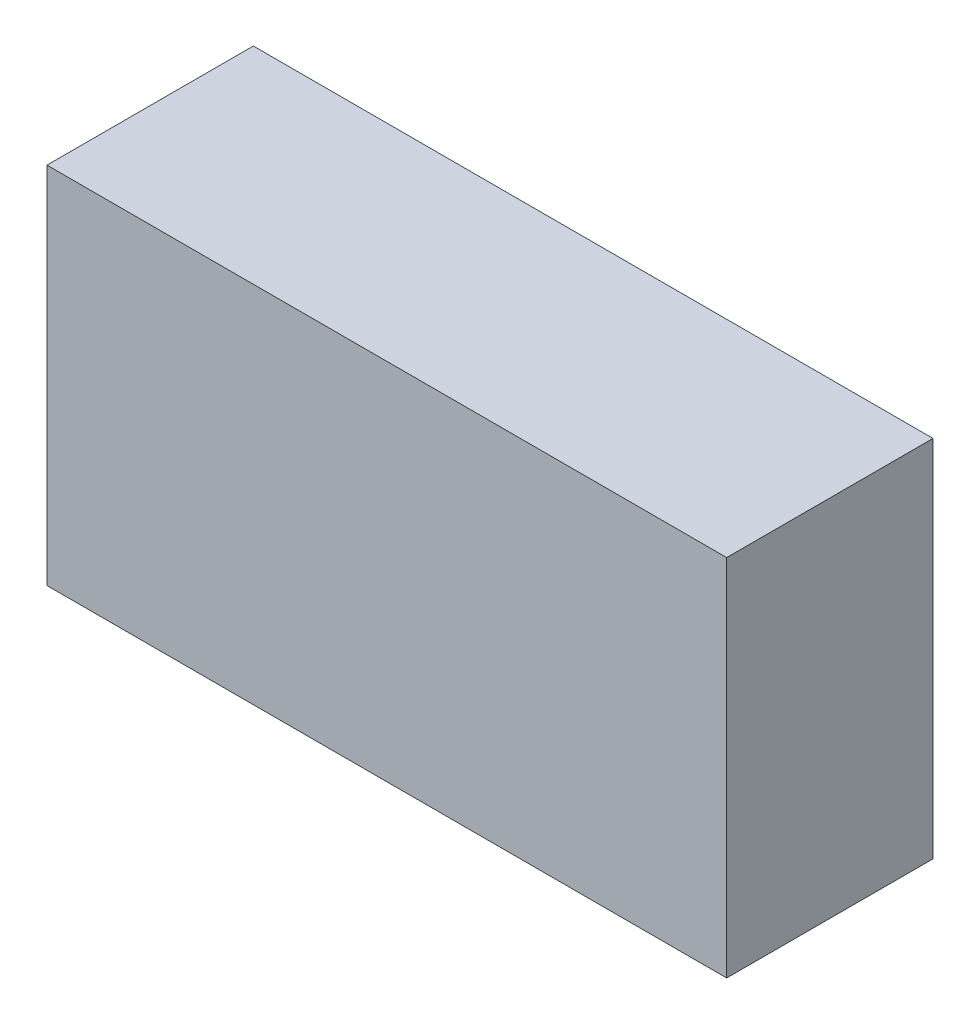
ISO-10303-21;
HEADER;
FILE_DESCRIPTION(('STEP AP214'),'2;1');
FILE_NAME('part.step','',(''),(''),'','','');
FILE_SCHEMA(('AUTOMOTIVE_DESIGN { 1 0 10303 214 1 1 1 1 }'));
ENDSEC;
DATA;
#1=APPLICATION_CONTEXT('core data for automotive mechanical design processes');
#2=APPLICATION_PROTOCOL_DEFINITION('international standard','automotive_design',2000,#1);
#3=PRODUCT_CONTEXT('',#1,'mechanical');
#4=PRODUCT('Part','Part','',(#3));
#5=PRODUCT_RELATED_PRODUCT_CATEGORY('part','',(#4));
#6=PRODUCT_DEFINITION_FORMATION('','',#4);
#7=PRODUCT_DEFINITION_CONTEXT('part definition',#1,'design');
#8=PRODUCT_DEFINITION('design','',#6,#7);
#9=PRODUCT_DEFINITION_SHAPE('','',#8);
#10=(LENGTH_UNIT() NAMED_UNIT(*) SI_UNIT(.MILLI.,.METRE.));
#11=(NAMED_UNIT(*) PLANE_ANGLE_UNIT() SI_UNIT($,.RADIAN.));
#12=(NAMED_UNIT(*) SI_UNIT($,.STERADIAN.) SOLID_ANGLE_UNIT());
#13=UNCERTAINTY_MEASURE_WITH_UNIT(LENGTH_MEASURE(1.E-05),#10,'distance_accuracy_value','');
#14=(GEOMETRIC_REPRESENTATION_CONTEXT(3) GLOBAL_UNCERTAINTY_ASSIGNED_CONTEXT((#13)) GLOBAL_UNIT_ASSIGNED_CONTEXT((#10,
#11,#12)) REPRESENTATION_CONTEXT('',''));
#15=CARTESIAN_POINT('',(0.,0.,0.));
#16=DIRECTION('',(0.,0.,1.));
#17=DIRECTION('',(1.,0.,0.));
#18=AXIS2_PLACEMENT_3D('',#15,#16,#17);
#19=CARTESIAN_POINT('',(0.,0.,17.));
#20=DIRECTION('',(1.,0.,0.));
#21=DIRECTION('',(0.,0.,-1.));
#22=AXIS2_PLACEMENT_3D('',#19,#20,#21);
#23=PLANE('',#22);
#24=DIRECTION('',(0.,-1.,0.));
#25=VECTOR('',#24,1.);
#26=CARTESIAN_POINT('',(0.,0.,0.));
#27=LINE('',#26,#25);
#28=CARTESIAN_POINT('',(0.,30.,0.));
#29=VERTEX_POINT('',#28);
#30=CARTESIAN_POINT('',(0.,0.,0.));
#31=VERTEX_POINT('',#30);
#32=EDGE_CURVE('E96',#29,#31,#27,.T.);
#33=ORIENTED_EDGE('',*,*,#32,.T.);
#34=DIRECTION('',(0.,0.,-1.));
#35=VECTOR('',#34,1.);
#36=CARTESIAN_POINT('',(0.,0.,17.));
#37=LINE('',#36,#35);
#38=CARTESIAN_POINT('',(0.,0.,17.));
#39=VERTEX_POINT('',#38);
#40=EDGE_CURVE('E11',#39,#31,#37,.T.);
#41=ORIENTED_EDGE('',*,*,#40,.F.);
#42=DIRECTION('',(0.,-1.,0.));
#43=VECTOR('',#42,1.);
#44=CARTESIAN_POINT('',(0.,0.,17.));
#45=LINE('',#44,#43);
#46=CARTESIAN_POINT('',(0.,30.,17.));
#47=VERTEX_POINT('',#46);
#48=EDGE_CURVE('E84',#47,#39,#45,.T.);
#49=ORIENTED_EDGE('',*,*,#48,.F.);
#50=DIRECTION('',(0.,0.,-1.));
#51=VECTOR('',#50,1.);
#52=CARTESIAN_POINT('',(0.,30.,17.));
#53=LINE('',#52,#51);
#54=EDGE_CURVE('E92',#47,#29,#53,.T.);
#55=ORIENTED_EDGE('',*,*,#54,.T.);
#56=EDGE_LOOP('',(#33,#41,#49,#55));
#57=FACE_BOUND('',#56,.T.);
#58=ADVANCED_FACE('F33',(#57),#23,.F.);
#59=CARTESIAN_POINT('',(0.,0.,17.));
#60=DIRECTION('',(0.,1.,0.));
#61=DIRECTION('',(0.,0.,1.));
#62=AXIS2_PLACEMENT_3D('',#59,#60,#61);
#63=PLANE('',#62);
#64=DIRECTION('',(1.,0.,0.));
#65=VECTOR('',#64,1.);
#66=CARTESIAN_POINT('',(0.,0.,0.));
#67=LINE('',#66,#65);
#68=CARTESIAN_POINT('',(56.,0.,0.));
#69=VERTEX_POINT('',#68);
#70=EDGE_CURVE('E88',#31,#69,#67,.T.);
#71=ORIENTED_EDGE('',*,*,#70,.T.);
#72=DIRECTION('',(0.,0.,-1.));
#73=VECTOR('',#72,1.);
#74=CARTESIAN_POINT('',(56.,0.,17.));
#75=LINE('',#74,#73);
#76=CARTESIAN_POINT('',(56.,0.,17.));
#77=VERTEX_POINT('',#76);
#78=EDGE_CURVE('E41',#77,#69,#75,.T.);
#79=ORIENTED_EDGE('',*,*,#78,.F.);
#80=DIRECTION('',(1.,0.,0.));
#81=VECTOR('',#80,1.);
#82=CARTESIAN_POINT('',(0.,0.,17.));
#83=LINE('',#82,#81);
#84=EDGE_CURVE('E79',#39,#77,#83,.T.);
#85=ORIENTED_EDGE('',*,*,#84,.F.);
#86=ORIENTED_EDGE('',*,*,#40,.T.);
#87=EDGE_LOOP('',(#71,#79,#85,#86));
#88=FACE_BOUND('',#87,.T.);
#89=ADVANCED_FACE('F87',(#88),#63,.F.);
#90=CARTESIAN_POINT('',(56.,0.,17.));
#91=DIRECTION('',(-1.,0.,0.));
#92=DIRECTION('',(0.,0.,1.));
#93=AXIS2_PLACEMENT_3D('',#90,#91,#92);
#94=PLANE('',#93);
#95=DIRECTION('',(0.,1.,0.));
#96=VECTOR('',#95,1.);
#97=CARTESIAN_POINT('',(56.,0.,0.));
#98=LINE('',#97,#96);
#99=CARTESIAN_POINT('',(56.,30.,0.));
#100=VERTEX_POINT('',#99);
#101=EDGE_CURVE('E66',#69,#100,#98,.T.);
#102=ORIENTED_EDGE('',*,*,#101,.T.);
#103=DIRECTION('',(0.,0.,-1.));
#104=VECTOR('',#103,1.);
#105=CARTESIAN_POINT('',(56.,30.,17.));
#106=LINE('',#105,#104);
#107=CARTESIAN_POINT('',(56.,30.,17.));
#108=VERTEX_POINT('',#107);
#109=EDGE_CURVE('E89',#108,#100,#106,.T.);
#110=ORIENTED_EDGE('',*,*,#109,.F.);
#111=DIRECTION('',(0.,1.,0.));
#112=VECTOR('',#111,1.);
#113=CARTESIAN_POINT('',(56.,0.,17.));
#114=LINE('',#113,#112);
#115=EDGE_CURVE('E82',#77,#108,#114,.T.);
#116=ORIENTED_EDGE('',*,*,#115,.F.);
#117=ORIENTED_EDGE('',*,*,#78,.T.);
#118=EDGE_LOOP('',(#102,#110,#116,#117));
#119=FACE_BOUND('',#118,.T.);
#120=ADVANCED_FACE('F90',(#119),#94,.F.);
#121=CARTESIAN_POINT('',(0.,30.,17.));
#122=DIRECTION('',(0.,-1.,0.));
#123=DIRECTION('',(0.,0.,-1.));
#124=AXIS2_PLACEMENT_3D('',#121,#122,#123);
#125=PLANE('',#124);
#126=DIRECTION('',(-1.,0.,0.));
#127=VECTOR('',#126,1.);
#128=CARTESIAN_POINT('',(0.,30.,0.));
#129=LINE('',#128,#127);
#130=EDGE_CURVE('E72',#100,#29,#129,.T.);
#131=ORIENTED_EDGE('',*,*,#130,.T.);
#132=ORIENTED_EDGE('',*,*,#54,.F.);
#133=DIRECTION('',(-1.,0.,0.));
#134=VECTOR('',#133,1.);
#135=CARTESIAN_POINT('',(0.,30.,17.));
#136=LINE('',#135,#134);
#137=EDGE_CURVE('E49',#108,#47,#136,.T.);
#138=ORIENTED_EDGE('',*,*,#137,.F.);
#139=ORIENTED_EDGE('',*,*,#109,.T.);
#140=EDGE_LOOP('',(#131,#132,#138,#139));
#141=FACE_BOUND('',#140,.T.);
#142=ADVANCED_FACE('F103',(#141),#125,.F.);
#143=CARTESIAN_POINT('',(0.,0.,17.));
#144=DIRECTION('',(0.,0.,-1.));
#145=DIRECTION('',(-1.,0.,0.));
#146=AXIS2_PLACEMENT_3D('',#143,#144,#145);
#147=PLANE('',#146);
#148=ORIENTED_EDGE('',*,*,#48,.T.);
#149=ORIENTED_EDGE('',*,*,#84,.T.);
#150=ORIENTED_EDGE('',*,*,#115,.T.);
#151=ORIENTED_EDGE('',*,*,#137,.T.);
#152=EDGE_LOOP('',(#148,#149,#150,#151));
#153=FACE_BOUND('',#152,.T.);
#154=ADVANCED_FACE('F80',(#153),#147,.F.);
#155=CARTESIAN_POINT('',(0.,0.,0.));
#156=DIRECTION('',(0.,0.,-1.));
#157=DIRECTION('',(-1.,0.,0.));
#158=AXIS2_PLACEMENT_3D('',#155,#156,#157);
#159=PLANE('',#158);
#160=ORIENTED_EDGE('',*,*,#32,.F.);
#161=ORIENTED_EDGE('',*,*,#130,.F.);
#162=ORIENTED_EDGE('',*,*,#101,.F.);
#163=ORIENTED_EDGE('',*,*,#70,.F.);
#164=EDGE_LOOP('',(#160,#161,#162,#163));
#165=FACE_BOUND('',#164,.T.);
#166=ADVANCED_FACE('F106',(#165),#159,.T.);
#167=CLOSED_SHELL('',(#58,#89,#120,#142,#154,#166));
#168=MANIFOLD_SOLID_BREP('B2',#167);
#169=ADVANCED_BREP_SHAPE_REPRESENTATION('',(#18,#168),#14);
#170=SHAPE_DEFINITION_REPRESENTATION(#9,#169);
ENDSEC;
END-ISO-10303-21;
